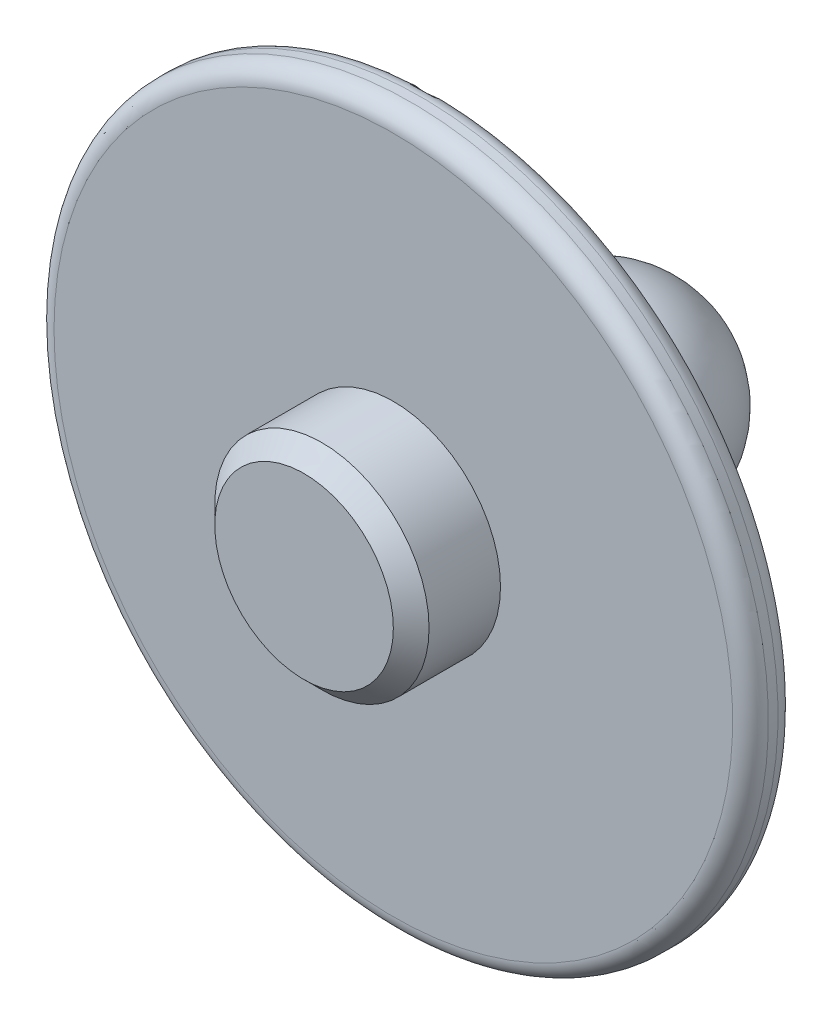
ISO-10303-21;
HEADER;
FILE_DESCRIPTION(('STEP AP214'),'2;1');
FILE_NAME('part.step','',(''),(''),'','','');
FILE_SCHEMA(('AUTOMOTIVE_DESIGN { 1 0 10303 214 1 1 1 1 }'));
ENDSEC;
DATA;
#1=APPLICATION_CONTEXT('core data for automotive mechanical design processes');
#2=APPLICATION_PROTOCOL_DEFINITION('international standard','automotive_design',2000,#1);
#3=PRODUCT_CONTEXT('',#1,'mechanical');
#4=PRODUCT('Part','Part','',(#3));
#5=PRODUCT_RELATED_PRODUCT_CATEGORY('part','',(#4));
#6=PRODUCT_DEFINITION_FORMATION('','',#4);
#7=PRODUCT_DEFINITION_CONTEXT('part definition',#1,'design');
#8=PRODUCT_DEFINITION('design','',#6,#7);
#9=PRODUCT_DEFINITION_SHAPE('','',#8);
#10=(LENGTH_UNIT() NAMED_UNIT(*) SI_UNIT(.MILLI.,.METRE.));
#11=(NAMED_UNIT(*) PLANE_ANGLE_UNIT() SI_UNIT($,.RADIAN.));
#12=(NAMED_UNIT(*) SI_UNIT($,.STERADIAN.) SOLID_ANGLE_UNIT());
#13=UNCERTAINTY_MEASURE_WITH_UNIT(LENGTH_MEASURE(1.E-05),#10,'distance_accuracy_value','');
#14=(GEOMETRIC_REPRESENTATION_CONTEXT(3) GLOBAL_UNCERTAINTY_ASSIGNED_CONTEXT((#13)) GLOBAL_UNIT_ASSIGNED_CONTEXT((#10,
#11,#12)) REPRESENTATION_CONTEXT('',''));
#15=CARTESIAN_POINT('',(0.,0.,0.));
#16=DIRECTION('',(0.,0.,1.));
#17=DIRECTION('',(1.,0.,0.));
#18=AXIS2_PLACEMENT_3D('',#15,#16,#17);
#19=CARTESIAN_POINT('',(0.,0.,5.));
#20=DIRECTION('',(0.,0.,-1.));
#21=DIRECTION('',(-1.,0.,0.));
#22=AXIS2_PLACEMENT_3D('',#19,#20,#21);
#23=CYLINDRICAL_SURFACE('',#22,6.);
#24=CARTESIAN_POINT('',(0.,0.,4.00000000000001));
#25=DIRECTION('',(0.,0.,1.));
#26=DIRECTION('',(1.,0.,0.));
#27=AXIS2_PLACEMENT_3D('',#24,#25,#26);
#28=CIRCLE('',#27,6.);
#29=CARTESIAN_POINT('',(6.,0.,4.00000000000001));
#30=VERTEX_POINT('',#29);
#31=EDGE_CURVE('E69',#30,#30,#28,.F.);
#32=ORIENTED_EDGE('',*,*,#31,.T.);
#33=EDGE_LOOP('',(#32));
#34=FACE_BOUND('',#33,.T.);
#35=CARTESIAN_POINT('',(0.,0.,0.));
#36=DIRECTION('',(0.,0.,1.));
#37=DIRECTION('',(1.,0.,0.));
#38=AXIS2_PLACEMENT_3D('',#35,#36,#37);
#39=CIRCLE('',#38,6.);
#40=CARTESIAN_POINT('',(6.,0.,0.));
#41=VERTEX_POINT('',#40);
#42=EDGE_CURVE('E77',#41,#41,#39,.T.);
#43=ORIENTED_EDGE('',*,*,#42,.T.);
#44=EDGE_LOOP('',(#43));
#45=FACE_BOUND('',#44,.T.);
#46=ADVANCED_FACE('F45',(#34,#45),#23,.T.);
#47=CARTESIAN_POINT('',(0.,0.,5.));
#48=DIRECTION('',(0.,0.,1.));
#49=DIRECTION('',(1.,0.,0.));
#50=AXIS2_PLACEMENT_3D('',#47,#48,#49);
#51=PLANE('',#50);
#52=CARTESIAN_POINT('',(0.,0.,5.));
#53=DIRECTION('',(0.,0.,1.));
#54=DIRECTION('',(1.,0.,0.));
#55=AXIS2_PLACEMENT_3D('',#52,#53,#54);
#56=CIRCLE('',#55,5.00000000000001);
#57=CARTESIAN_POINT('',(5.00000000000001,0.,5.));
#58=VERTEX_POINT('',#57);
#59=EDGE_CURVE('E73',#58,#58,#56,.T.);
#60=ORIENTED_EDGE('',*,*,#59,.T.);
#61=EDGE_LOOP('',(#60));
#62=FACE_BOUND('',#61,.T.);
#63=ADVANCED_FACE('F90',(#62),#51,.T.);
#64=CARTESIAN_POINT('',(0.,0.,-11.5));
#65=DIRECTION('',(0.,0.,1.));
#66=DIRECTION('',(0.,1.,0.));
#67=AXIS2_PLACEMENT_3D('',#64,#65,#66);
#68=SPHERICAL_SURFACE('',#67,6.);
#69=CARTESIAN_POINT('',(0.,0.,-8.96432463572564));
#70=DIRECTION('',(0.,0.,1.));
#71=DIRECTION('',(1.,0.,0.));
#72=AXIS2_PLACEMENT_3D('',#69,#70,#71);
#73=CIRCLE('',#72,5.43786267268787);
#74=CARTESIAN_POINT('',(5.43786267268787,0.,-8.96432463572565));
#75=VERTEX_POINT('',#74);
#76=EDGE_CURVE('E81',#75,#75,#73,.T.);
#77=ORIENTED_EDGE('',*,*,#76,.F.);
#78=EDGE_LOOP('',(#77));
#79=FACE_BOUND('',#78,.T.);
#80=ADVANCED_FACE('F88',(#79),#68,.T.);
#81=CARTESIAN_POINT('',(0.,0.,-8.96432463572564));
#82=DIRECTION('',(0.,0.,1.));
#83=DIRECTION('',(1.,0.,0.));
#84=AXIS2_PLACEMENT_3D('',#81,#82,#83);
#85=CONICAL_SURFACE('',#84,5.43786267268787,1.13447030417584);
#86=CARTESIAN_POINT('',(0.,0.,-2.44323576293981));
#87=DIRECTION('',(0.,0.,-1.));
#88=DIRECTION('',(-1.,0.,0.));
#89=AXIS2_PLACEMENT_3D('',#86,#87,#88);
#90=CIRCLE('',#89,19.4226125607124);
#91=CARTESIAN_POINT('',(19.4226125607124,0.,-2.44323576293981));
#92=VERTEX_POINT('',#91);
#93=EDGE_CURVE('E53',#92,#92,#90,.T.);
#94=CARTESIAN_POINT('',(19.4226125607124,0.,-2.44323576293981));
#95=CARTESIAN_POINT('',(19.2769380827121,0.,-2.51116377203133));
#96=CARTESIAN_POINT('',(19.1312636047119,0.,-2.57909178112285));
#97=CARTESIAN_POINT('',(18.8399146487114,0.,-2.71494779930589));
#98=CARTESIAN_POINT('',(18.6942401707111,0.,-2.78287580839741));
#99=CARTESIAN_POINT('',(18.4028912147106,0.,-2.91873182658044));
#100=CARTESIAN_POINT('',(18.2572167367104,0.,-2.98665983567196));
#101=CARTESIAN_POINT('',(17.9658677807098,0.,-3.122515853855));
#102=CARTESIAN_POINT('',(17.8201933027096,0.,-3.19044386294652));
#103=CARTESIAN_POINT('',(17.5288443467091,0.,-3.32629988112956));
#104=CARTESIAN_POINT('',(17.3831698687088,0.,-3.39422789022108));
#105=CARTESIAN_POINT('',(17.0918209127083,0.,-3.53008390840412));
#106=CARTESIAN_POINT('',(16.9461464347081,0.,-3.59801191749564));
#107=CARTESIAN_POINT('',(16.6547974787075,0.,-3.73386793567867));
#108=CARTESIAN_POINT('',(16.5091230007073,0.,-3.80179594477019));
#109=CARTESIAN_POINT('',(16.2177740447068,0.,-3.93765196295323));
#110=CARTESIAN_POINT('',(16.0720995667065,0.,-4.00557997204475));
#111=CARTESIAN_POINT('',(15.780750610706,0.,-4.14143599022779));
#112=CARTESIAN_POINT('',(15.6350761327058,0.,-4.20936399931931));
#113=CARTESIAN_POINT('',(15.3437271767052,0.,-4.34522001750235));
#114=CARTESIAN_POINT('',(15.198052698705,0.,-4.41314802659386));
#115=CARTESIAN_POINT('',(14.9067037427045,0.,-4.5490040447769));
#116=CARTESIAN_POINT('',(14.7610292647042,0.,-4.61693205386842));
#117=CARTESIAN_POINT('',(14.4696803087037,0.,-4.75278807205146));
#118=CARTESIAN_POINT('',(14.3240058307035,0.,-4.82071608114298));
#119=CARTESIAN_POINT('',(14.0326568747029,0.,-4.95657209932602));
#120=CARTESIAN_POINT('',(13.8869823967027,0.,-5.02450010841754));
#121=CARTESIAN_POINT('',(13.5956334407022,0.,-5.16035612660058));
#122=CARTESIAN_POINT('',(13.4499589627019,0.,-5.22828413569209));
#123=CARTESIAN_POINT('',(13.1586100067014,0.,-5.36414015387513));
#124=CARTESIAN_POINT('',(13.0129355287012,0.,-5.43206816296665));
#125=CARTESIAN_POINT('',(12.7215865727006,0.,-5.56792418114969));
#126=CARTESIAN_POINT('',(12.5759120947004,0.,-5.63585219024121));
#127=CARTESIAN_POINT('',(12.2845631386999,0.,-5.77170820842425));
#128=CARTESIAN_POINT('',(12.1388886606996,0.,-5.83963621751577));
#129=CARTESIAN_POINT('',(11.8475397046991,0.,-5.9754922356988));
#130=CARTESIAN_POINT('',(11.7018652266989,0.,-6.04342024479032));
#131=CARTESIAN_POINT('',(11.4105162706983,0.,-6.17927626297336));
#132=CARTESIAN_POINT('',(11.2648417926981,0.,-6.24720427206488));
#133=CARTESIAN_POINT('',(10.9734928366976,0.,-6.38306029024792));
#134=CARTESIAN_POINT('',(10.8278183586973,0.,-6.45098829933944));
#135=CARTESIAN_POINT('',(10.5364694026968,0.,-6.58684431752248));
#136=CARTESIAN_POINT('',(10.3907949246966,0.,-6.654772326614));
#137=CARTESIAN_POINT('',(10.099445968696,0.,-6.79062834479703));
#138=CARTESIAN_POINT('',(9.95377149069579,0.,-6.85855635388855));
#139=CARTESIAN_POINT('',(9.66242253469528,0.,-6.99441237207159));
#140=CARTESIAN_POINT('',(9.51674805669503,0.,-7.06234038116311));
#141=CARTESIAN_POINT('',(9.22539910069451,0.,-7.19819639934615));
#142=CARTESIAN_POINT('',(9.07972462269426,0.,-7.26612440843767));
#143=CARTESIAN_POINT('',(8.78837566669375,0.,-7.40198042662071));
#144=CARTESIAN_POINT('',(8.64270118869349,0.,-7.46990843571222));
#145=CARTESIAN_POINT('',(8.35135223269298,0.,-7.60576445389526));
#146=CARTESIAN_POINT('',(8.20567775469272,0.,-7.67369246298678));
#147=CARTESIAN_POINT('',(7.91432879869221,0.,-7.80954848116982));
#148=CARTESIAN_POINT('',(7.76865432069196,0.,-7.87747649026134));
#149=CARTESIAN_POINT('',(7.47730536469145,0.,-8.01333250844438));
#150=CARTESIAN_POINT('',(7.33163088669119,0.,-8.0812605175359));
#151=CARTESIAN_POINT('',(7.04028193069068,0.,-8.21711653571894));
#152=CARTESIAN_POINT('',(6.89460745269043,0.,-8.28504454481045));
#153=CARTESIAN_POINT('',(6.60325849668992,0.,-8.42090056299349));
#154=CARTESIAN_POINT('',(6.45758401868966,0.,-8.48882857208501));
#155=CARTESIAN_POINT('',(6.16623506268915,0.,-8.62468459026805));
#156=CARTESIAN_POINT('',(6.02056058468889,0.,-8.69261259935957));
#157=CARTESIAN_POINT('',(5.72921162868838,0.,-8.82846861754261));
#158=CARTESIAN_POINT('',(5.58353715068813,0.,-8.89639662663413));
#159=CARTESIAN_POINT('',(5.43786267268787,0.,-8.96432463572564));
#160=B_SPLINE_CURVE_WITH_KNOTS('',3,(#94,#95,#96,#97,#98,#99,#100,#101,#102,#103,#104,#105,#106,
#107,#108,#109,#110,#111,#112,#113,#114,#115,#116,#117,#118,#119,#120,#121,#122,#123,#124,#125,
#126,#127,#128,#129,#130,#131,#132,#133,#134,#135,#136,#137,#138,#139,#140,#141,#142,#143,#144,
#145,#146,#147,#148,#149,#150,#151,#152,#153,#154,#155,#156,#157,#158,#159),.UNSPECIFIED.,.F.,
.F.,(4,2,2,2,2,2,2,2,2,2,2,2,2,2,2,2,2,2,2,2,2,2,2,2,2,2,2,2,2,2,2,2,4),(0.,0.482200592739219,
0.964401185478445,1.44660177821767,1.9288023709569,2.41100296369612,2.89320355643535,
3.37540414917457,3.85760474191379,4.33980533465302,4.82200592739224,5.30420652013147,
5.78640711287069,6.26860770560992,6.75080829834915,7.23300889108837,7.7152094838276,
8.19741007656682,8.67961066930605,9.16181126204527,9.64401185478449,10.1262124475237,
10.6084130402629,11.0906136330022,11.5728142257414,12.0550148184806,12.5372154112198,
13.0194160039591,13.5016165966983,13.9838171894375,14.4660177821767,14.948218374916,
15.4304189676552),.UNSPECIFIED.);
#161=EDGE_CURVE('BSEAM86',#92,#75,#160,.T.);
#162=ORIENTED_EDGE('',*,*,#93,.T.);
#163=ORIENTED_EDGE('',*,*,#76,.T.);
#164=ORIENTED_EDGE('',*,*,#161,.T.);
#165=ORIENTED_EDGE('',*,*,#161,.F.);
#166=EDGE_LOOP('',(#162,#164,#163,#165));
#167=FACE_BOUND('',#166,.T.);
#168=ADVANCED_FACE('F86',(#167),#85,.T.);
#169=CARTESIAN_POINT('',(0.,0.,0.));
#170=DIRECTION('',(0.,0.,1.));
#171=DIRECTION('',(1.,0.,0.));
#172=AXIS2_PLACEMENT_3D('',#169,#170,#171);
#173=CYLINDRICAL_SURFACE('',#172,20.);
#174=CARTESIAN_POINT('',(0.,0.,-1.53692531749183));
#175=DIRECTION('',(0.,0.,-1.));
#176=DIRECTION('',(-1.,0.,0.));
#177=AXIS2_PLACEMENT_3D('',#174,#175,#176);
#178=CIRCLE('',#177,20.);
#179=CARTESIAN_POINT('',(-20.,0.,-1.53692531749183));
#180=VERTEX_POINT('',#179);
#181=EDGE_CURVE('E58',#180,#180,#178,.F.);
#182=ORIENTED_EDGE('',*,*,#181,.T.);
#183=EDGE_LOOP('',(#182));
#184=FACE_BOUND('',#183,.T.);
#185=CARTESIAN_POINT('',(0.,0.,-1.));
#186=DIRECTION('',(0.,0.,-1.));
#187=DIRECTION('',(-1.,0.,0.));
#188=AXIS2_PLACEMENT_3D('',#185,#186,#187);
#189=CIRCLE('',#188,20.);
#190=CARTESIAN_POINT('',(-20.,0.,-1.));
#191=VERTEX_POINT('',#190);
#192=EDGE_CURVE('E63',#191,#191,#189,.T.);
#193=ORIENTED_EDGE('',*,*,#192,.T.);
#194=EDGE_LOOP('',(#193));
#195=FACE_BOUND('',#194,.T.);
#196=ADVANCED_FACE('F96',(#184,#195),#173,.T.);
#197=CARTESIAN_POINT('',(0.,0.,0.));
#198=DIRECTION('',(0.,0.,-1.));
#199=DIRECTION('',(-1.,0.,0.));
#200=AXIS2_PLACEMENT_3D('',#197,#198,#199);
#201=PLANE('',#200);
#202=CARTESIAN_POINT('',(0.,0.,0.));
#203=DIRECTION('',(0.,0.,-1.));
#204=DIRECTION('',(-1.,0.,0.));
#205=AXIS2_PLACEMENT_3D('',#202,#203,#204);
#206=CIRCLE('',#205,19.);
#207=CARTESIAN_POINT('',(-19.,0.,0.));
#208=VERTEX_POINT('',#207);
#209=EDGE_CURVE('E10',#208,#208,#206,.F.);
#210=ORIENTED_EDGE('',*,*,#209,.T.);
#211=EDGE_LOOP('',(#210));
#212=FACE_BOUND('',#211,.T.);
#213=ORIENTED_EDGE('',*,*,#42,.F.);
#214=EDGE_LOOP('',(#213));
#215=FACE_BOUND('',#214,.T.);
#216=ADVANCED_FACE('F113',(#212,#215),#201,.F.);
#217=CARTESIAN_POINT('',(0.,0.,5.));
#218=DIRECTION('',(0.,0.,-1.));
#219=DIRECTION('',(-1.,0.,0.));
#220=AXIS2_PLACEMENT_3D('',#217,#218,#219);
#221=CONICAL_SURFACE('',#220,5.00000000000001,0.785398163397445);
#222=ORIENTED_EDGE('',*,*,#31,.F.);
#223=EDGE_LOOP('',(#222));
#224=FACE_BOUND('',#223,.T.);
#225=ORIENTED_EDGE('',*,*,#59,.F.);
#226=EDGE_LOOP('',(#225));
#227=FACE_BOUND('',#226,.T.);
#228=ADVANCED_FACE('F108',(#224,#227),#221,.T.);
#229=CARTESIAN_POINT('',(0.,0.,-1.53692531749183));
#230=DIRECTION('',(0.,0.,-1.));
#231=DIRECTION('',(-1.,0.,0.));
#232=AXIS2_PLACEMENT_3D('',#229,#230,#231);
#233=TOROIDAL_SURFACE('',#232,19.,1.);
#234=ORIENTED_EDGE('',*,*,#93,.F.);
#235=EDGE_LOOP('',(#234));
#236=FACE_BOUND('',#235,.T.);
#237=ORIENTED_EDGE('',*,*,#181,.F.);
#238=EDGE_LOOP('',(#237));
#239=FACE_BOUND('',#238,.T.);
#240=ADVANCED_FACE('F112',(#236,#239),#233,.T.);
#241=CARTESIAN_POINT('',(0.,0.,-1.));
#242=DIRECTION('',(0.,0.,-1.));
#243=DIRECTION('',(-1.,0.,0.));
#244=AXIS2_PLACEMENT_3D('',#241,#242,#243);
#245=TOROIDAL_SURFACE('',#244,19.,1.);
#246=ORIENTED_EDGE('',*,*,#192,.F.);
#247=EDGE_LOOP('',(#246));
#248=FACE_BOUND('',#247,.T.);
#249=ORIENTED_EDGE('',*,*,#209,.F.);
#250=EDGE_LOOP('',(#249));
#251=FACE_BOUND('',#250,.T.);
#252=ADVANCED_FACE('F47',(#248,#251),#245,.T.);
#253=CLOSED_SHELL('',(#46,#63,#80,#168,#196,#216,#228,#240,#252));
#254=MANIFOLD_SOLID_BREP('B2',#253);
#255=ADVANCED_BREP_SHAPE_REPRESENTATION('',(#18,#254),#14);
#256=SHAPE_DEFINITION_REPRESENTATION(#9,#255);
ENDSEC;
END-ISO-10303-21;
